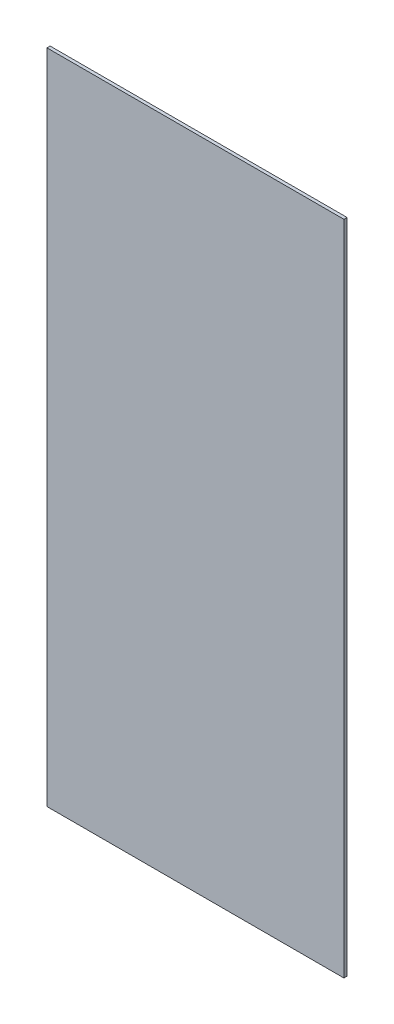
ISO-10303-21;
HEADER;
FILE_DESCRIPTION(('STEP AP214'),'2;1');
FILE_NAME('part.step','',(''),(''),'','','');
FILE_SCHEMA(('AUTOMOTIVE_DESIGN { 1 0 10303 214 1 1 1 1 }'));
ENDSEC;
DATA;
#1=APPLICATION_CONTEXT('core data for automotive mechanical design processes');
#2=APPLICATION_PROTOCOL_DEFINITION('international standard','automotive_design',2000,#1);
#3=PRODUCT_CONTEXT('',#1,'mechanical');
#4=PRODUCT('Part','Part','',(#3));
#5=PRODUCT_RELATED_PRODUCT_CATEGORY('part','',(#4));
#6=PRODUCT_DEFINITION_FORMATION('','',#4);
#7=PRODUCT_DEFINITION_CONTEXT('part definition',#1,'design');
#8=PRODUCT_DEFINITION('design','',#6,#7);
#9=PRODUCT_DEFINITION_SHAPE('','',#8);
#10=(LENGTH_UNIT() NAMED_UNIT(*) SI_UNIT(.MILLI.,.METRE.));
#11=(NAMED_UNIT(*) PLANE_ANGLE_UNIT() SI_UNIT($,.RADIAN.));
#12=(NAMED_UNIT(*) SI_UNIT($,.STERADIAN.) SOLID_ANGLE_UNIT());
#13=UNCERTAINTY_MEASURE_WITH_UNIT(LENGTH_MEASURE(1.E-05),#10,'distance_accuracy_value','');
#14=(GEOMETRIC_REPRESENTATION_CONTEXT(3) GLOBAL_UNCERTAINTY_ASSIGNED_CONTEXT((#13)) GLOBAL_UNIT_ASSIGNED_CONTEXT((#10,
#11,#12)) REPRESENTATION_CONTEXT('',''));
#15=CARTESIAN_POINT('',(0.,0.,0.));
#16=DIRECTION('',(0.,0.,1.));
#17=DIRECTION('',(1.,0.,0.));
#18=AXIS2_PLACEMENT_3D('',#15,#16,#17);
#19=CARTESIAN_POINT('',(47.,-104.,1.));
#20=DIRECTION('',(-1.,0.,0.));
#21=DIRECTION('',(0.,0.,1.));
#22=AXIS2_PLACEMENT_3D('',#19,#20,#21);
#23=PLANE('',#22);
#24=DIRECTION('',(0.,1.,0.));
#25=VECTOR('',#24,1.);
#26=CARTESIAN_POINT('',(47.,-104.,0.));
#27=LINE('',#26,#25);
#28=CARTESIAN_POINT('',(47.,-104.,0.));
#29=VERTEX_POINT('',#28);
#30=CARTESIAN_POINT('',(47.,104.,0.));
#31=VERTEX_POINT('',#30);
#32=EDGE_CURVE('E96',#29,#31,#27,.T.);
#33=ORIENTED_EDGE('',*,*,#32,.T.);
#34=DIRECTION('',(0.,0.,-1.));
#35=VECTOR('',#34,1.);
#36=CARTESIAN_POINT('',(47.,104.,1.));
#37=LINE('',#36,#35);
#38=CARTESIAN_POINT('',(47.,104.,1.));
#39=VERTEX_POINT('',#38);
#40=EDGE_CURVE('E11',#39,#31,#37,.T.);
#41=ORIENTED_EDGE('',*,*,#40,.F.);
#42=DIRECTION('',(0.,1.,0.));
#43=VECTOR('',#42,1.);
#44=CARTESIAN_POINT('',(47.,-104.,1.));
#45=LINE('',#44,#43);
#46=CARTESIAN_POINT('',(47.,-104.,1.));
#47=VERTEX_POINT('',#46);
#48=EDGE_CURVE('E84',#47,#39,#45,.T.);
#49=ORIENTED_EDGE('',*,*,#48,.F.);
#50=DIRECTION('',(0.,0.,-1.));
#51=VECTOR('',#50,1.);
#52=CARTESIAN_POINT('',(47.,-104.,1.));
#53=LINE('',#52,#51);
#54=EDGE_CURVE('E92',#47,#29,#53,.T.);
#55=ORIENTED_EDGE('',*,*,#54,.T.);
#56=EDGE_LOOP('',(#33,#41,#49,#55));
#57=FACE_BOUND('',#56,.T.);
#58=ADVANCED_FACE('F33',(#57),#23,.F.);
#59=CARTESIAN_POINT('',(-47.,104.,1.));
#60=DIRECTION('',(0.,-1.,0.));
#61=DIRECTION('',(0.,0.,-1.));
#62=AXIS2_PLACEMENT_3D('',#59,#60,#61);
#63=PLANE('',#62);
#64=DIRECTION('',(-1.,0.,0.));
#65=VECTOR('',#64,1.);
#66=CARTESIAN_POINT('',(-47.,104.,0.));
#67=LINE('',#66,#65);
#68=CARTESIAN_POINT('',(-47.,104.,0.));
#69=VERTEX_POINT('',#68);
#70=EDGE_CURVE('E88',#31,#69,#67,.T.);
#71=ORIENTED_EDGE('',*,*,#70,.T.);
#72=DIRECTION('',(0.,0.,-1.));
#73=VECTOR('',#72,1.);
#74=CARTESIAN_POINT('',(-47.,104.,1.));
#75=LINE('',#74,#73);
#76=CARTESIAN_POINT('',(-47.,104.,1.));
#77=VERTEX_POINT('',#76);
#78=EDGE_CURVE('E41',#77,#69,#75,.T.);
#79=ORIENTED_EDGE('',*,*,#78,.F.);
#80=DIRECTION('',(-1.,0.,0.));
#81=VECTOR('',#80,1.);
#82=CARTESIAN_POINT('',(-47.,104.,1.));
#83=LINE('',#82,#81);
#84=EDGE_CURVE('E79',#39,#77,#83,.T.);
#85=ORIENTED_EDGE('',*,*,#84,.F.);
#86=ORIENTED_EDGE('',*,*,#40,.T.);
#87=EDGE_LOOP('',(#71,#79,#85,#86));
#88=FACE_BOUND('',#87,.T.);
#89=ADVANCED_FACE('F87',(#88),#63,.F.);
#90=CARTESIAN_POINT('',(-47.,-104.,1.));
#91=DIRECTION('',(1.,0.,0.));
#92=DIRECTION('',(0.,0.,-1.));
#93=AXIS2_PLACEMENT_3D('',#90,#91,#92);
#94=PLANE('',#93);
#95=DIRECTION('',(0.,-1.,0.));
#96=VECTOR('',#95,1.);
#97=CARTESIAN_POINT('',(-47.,-104.,0.));
#98=LINE('',#97,#96);
#99=CARTESIAN_POINT('',(-47.,-104.,0.));
#100=VERTEX_POINT('',#99);
#101=EDGE_CURVE('E66',#69,#100,#98,.T.);
#102=ORIENTED_EDGE('',*,*,#101,.T.);
#103=DIRECTION('',(0.,0.,-1.));
#104=VECTOR('',#103,1.);
#105=CARTESIAN_POINT('',(-47.,-104.,1.));
#106=LINE('',#105,#104);
#107=CARTESIAN_POINT('',(-47.,-104.,1.));
#108=VERTEX_POINT('',#107);
#109=EDGE_CURVE('E89',#108,#100,#106,.T.);
#110=ORIENTED_EDGE('',*,*,#109,.F.);
#111=DIRECTION('',(0.,-1.,0.));
#112=VECTOR('',#111,1.);
#113=CARTESIAN_POINT('',(-47.,-104.,1.));
#114=LINE('',#113,#112);
#115=EDGE_CURVE('E82',#77,#108,#114,.T.);
#116=ORIENTED_EDGE('',*,*,#115,.F.);
#117=ORIENTED_EDGE('',*,*,#78,.T.);
#118=EDGE_LOOP('',(#102,#110,#116,#117));
#119=FACE_BOUND('',#118,.T.);
#120=ADVANCED_FACE('F90',(#119),#94,.F.);
#121=CARTESIAN_POINT('',(-47.,-104.,1.));
#122=DIRECTION('',(0.,1.,0.));
#123=DIRECTION('',(0.,0.,1.));
#124=AXIS2_PLACEMENT_3D('',#121,#122,#123);
#125=PLANE('',#124);
#126=DIRECTION('',(1.,0.,0.));
#127=VECTOR('',#126,1.);
#128=CARTESIAN_POINT('',(-47.,-104.,0.));
#129=LINE('',#128,#127);
#130=EDGE_CURVE('E72',#100,#29,#129,.T.);
#131=ORIENTED_EDGE('',*,*,#130,.T.);
#132=ORIENTED_EDGE('',*,*,#54,.F.);
#133=DIRECTION('',(1.,0.,0.));
#134=VECTOR('',#133,1.);
#135=CARTESIAN_POINT('',(-47.,-104.,1.));
#136=LINE('',#135,#134);
#137=EDGE_CURVE('E49',#108,#47,#136,.T.);
#138=ORIENTED_EDGE('',*,*,#137,.F.);
#139=ORIENTED_EDGE('',*,*,#109,.T.);
#140=EDGE_LOOP('',(#131,#132,#138,#139));
#141=FACE_BOUND('',#140,.T.);
#142=ADVANCED_FACE('F103',(#141),#125,.F.);
#143=CARTESIAN_POINT('',(47.,104.,1.));
#144=DIRECTION('',(0.,0.,-1.));
#145=DIRECTION('',(-1.,0.,0.));
#146=AXIS2_PLACEMENT_3D('',#143,#144,#145);
#147=PLANE('',#146);
#148=ORIENTED_EDGE('',*,*,#48,.T.);
#149=ORIENTED_EDGE('',*,*,#84,.T.);
#150=ORIENTED_EDGE('',*,*,#115,.T.);
#151=ORIENTED_EDGE('',*,*,#137,.T.);
#152=EDGE_LOOP('',(#148,#149,#150,#151));
#153=FACE_BOUND('',#152,.T.);
#154=ADVANCED_FACE('F80',(#153),#147,.F.);
#155=CARTESIAN_POINT('',(47.,104.,0.));
#156=DIRECTION('',(0.,0.,-1.));
#157=DIRECTION('',(-1.,0.,0.));
#158=AXIS2_PLACEMENT_3D('',#155,#156,#157);
#159=PLANE('',#158);
#160=ORIENTED_EDGE('',*,*,#32,.F.);
#161=ORIENTED_EDGE('',*,*,#130,.F.);
#162=ORIENTED_EDGE('',*,*,#101,.F.);
#163=ORIENTED_EDGE('',*,*,#70,.F.);
#164=EDGE_LOOP('',(#160,#161,#162,#163));
#165=FACE_BOUND('',#164,.T.);
#166=ADVANCED_FACE('F106',(#165),#159,.T.);
#167=CLOSED_SHELL('',(#58,#89,#120,#142,#154,#166));
#168=MANIFOLD_SOLID_BREP('B2',#167);
#169=ADVANCED_BREP_SHAPE_REPRESENTATION('',(#18,#168),#14);
#170=SHAPE_DEFINITION_REPRESENTATION(#9,#169);
ENDSEC;
END-ISO-10303-21;
